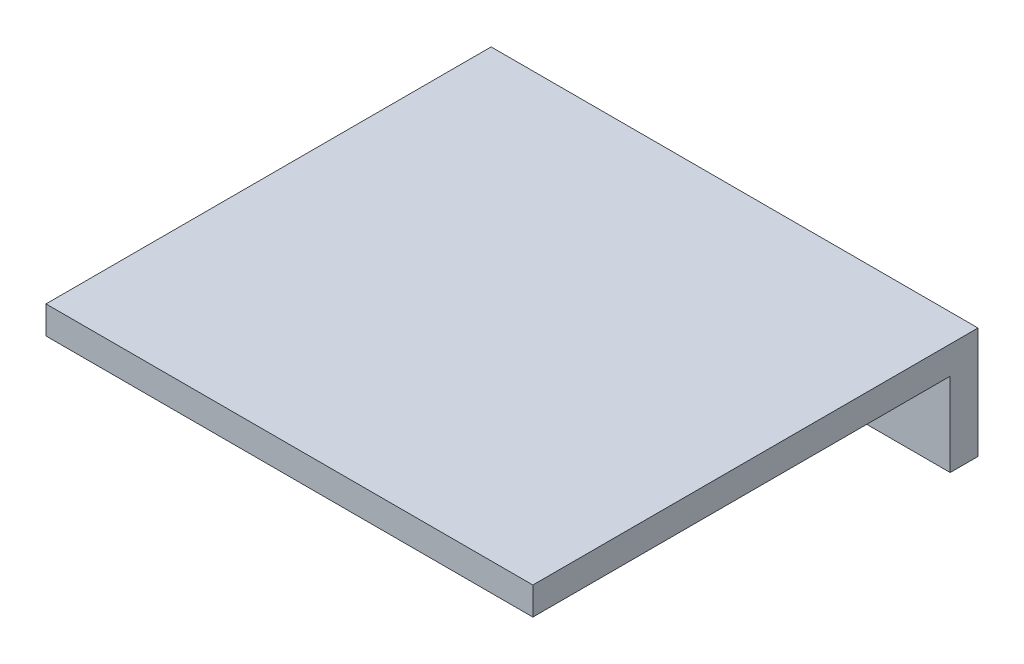
ISO-10303-21;
HEADER;
FILE_DESCRIPTION(('STEP AP214'),'2;1');
FILE_NAME('part.step','',(''),(''),'','','');
FILE_SCHEMA(('AUTOMOTIVE_DESIGN { 1 0 10303 214 1 1 1 1 }'));
ENDSEC;
DATA;
#1=APPLICATION_CONTEXT('core data for automotive mechanical design processes');
#2=APPLICATION_PROTOCOL_DEFINITION('international standard','automotive_design',2000,#1);
#3=PRODUCT_CONTEXT('',#1,'mechanical');
#4=PRODUCT('Part','Part','',(#3));
#5=PRODUCT_RELATED_PRODUCT_CATEGORY('part','',(#4));
#6=PRODUCT_DEFINITION_FORMATION('','',#4);
#7=PRODUCT_DEFINITION_CONTEXT('part definition',#1,'design');
#8=PRODUCT_DEFINITION('design','',#6,#7);
#9=PRODUCT_DEFINITION_SHAPE('','',#8);
#10=(LENGTH_UNIT() NAMED_UNIT(*) SI_UNIT(.MILLI.,.METRE.));
#11=(NAMED_UNIT(*) PLANE_ANGLE_UNIT() SI_UNIT($,.RADIAN.));
#12=(NAMED_UNIT(*) SI_UNIT($,.STERADIAN.) SOLID_ANGLE_UNIT());
#13=UNCERTAINTY_MEASURE_WITH_UNIT(LENGTH_MEASURE(1.E-05),#10,'distance_accuracy_value','');
#14=(GEOMETRIC_REPRESENTATION_CONTEXT(3) GLOBAL_UNCERTAINTY_ASSIGNED_CONTEXT((#13)) GLOBAL_UNIT_ASSIGNED_CONTEXT((#10,
#11,#12)) REPRESENTATION_CONTEXT('',''));
#15=CARTESIAN_POINT('',(0.,0.,0.));
#16=DIRECTION('',(0.,0.,1.));
#17=DIRECTION('',(1.,0.,0.));
#18=AXIS2_PLACEMENT_3D('',#15,#16,#17);
#19=CARTESIAN_POINT('',(0.,0.,2.));
#20=DIRECTION('',(0.,0.,1.));
#21=DIRECTION('',(1.,0.,0.));
#22=AXIS2_PLACEMENT_3D('',#19,#20,#21);
#23=PLANE('',#22);
#24=DIRECTION('',(1.,0.,0.));
#25=VECTOR('',#24,1.);
#26=CARTESIAN_POINT('',(-17.5,2.,2.));
#27=LINE('',#26,#25);
#28=CARTESIAN_POINT('',(-17.5,2.,2.));
#29=VERTEX_POINT('',#28);
#30=CARTESIAN_POINT('',(17.5,2.,2.));
#31=VERTEX_POINT('',#30);
#32=EDGE_CURVE('E61',#29,#31,#27,.T.);
#33=ORIENTED_EDGE('',*,*,#32,.F.);
#34=DIRECTION('',(0.,-1.,0.));
#35=VECTOR('',#34,1.);
#36=CARTESIAN_POINT('',(-17.5,4.,2.));
#37=LINE('',#36,#35);
#38=CARTESIAN_POINT('',(-17.5,-4.,2.));
#39=VERTEX_POINT('',#38);
#40=EDGE_CURVE('E176',#29,#39,#37,.T.);
#41=ORIENTED_EDGE('',*,*,#40,.T.);
#42=DIRECTION('',(1.,0.,0.));
#43=VECTOR('',#42,1.);
#44=CARTESIAN_POINT('',(-17.5,-4.,2.));
#45=LINE('',#44,#43);
#46=CARTESIAN_POINT('',(17.5,-4.,2.));
#47=VERTEX_POINT('',#46);
#48=EDGE_CURVE('E67',#39,#47,#45,.T.);
#49=ORIENTED_EDGE('',*,*,#48,.T.);
#50=DIRECTION('',(0.,1.,0.));
#51=VECTOR('',#50,1.);
#52=CARTESIAN_POINT('',(17.5,4.,2.));
#53=LINE('',#52,#51);
#54=EDGE_CURVE('E97',#47,#31,#53,.T.);
#55=ORIENTED_EDGE('',*,*,#54,.T.);
#56=EDGE_LOOP('',(#33,#41,#49,#55));
#57=FACE_BOUND('',#56,.T.);
#58=CARTESIAN_POINT('',(12.,0.,2.));
#59=DIRECTION('',(0.,0.,1.));
#60=DIRECTION('',(1.,0.,0.));
#61=AXIS2_PLACEMENT_3D('',#58,#59,#60);
#62=CIRCLE('',#61,1.35);
#63=CARTESIAN_POINT('',(13.35,0.,2.));
#64=VERTEX_POINT('',#63);
#65=EDGE_CURVE('E111',#64,#64,#62,.T.);
#66=ORIENTED_EDGE('',*,*,#65,.F.);
#67=EDGE_LOOP('',(#66));
#68=FACE_BOUND('',#67,.T.);
#69=CARTESIAN_POINT('',(-12.,0.,2.));
#70=DIRECTION('',(0.,0.,1.));
#71=DIRECTION('',(-1.,0.,0.));
#72=AXIS2_PLACEMENT_3D('',#69,#70,#71);
#73=CIRCLE('',#72,1.35);
#74=CARTESIAN_POINT('',(-13.35,0.,2.));
#75=VERTEX_POINT('',#74);
#76=EDGE_CURVE('E165',#75,#75,#73,.T.);
#77=ORIENTED_EDGE('',*,*,#76,.F.);
#78=EDGE_LOOP('',(#77));
#79=FACE_BOUND('',#78,.T.);
#80=ADVANCED_FACE('F45',(#57,#68,#79),#23,.T.);
#81=CARTESIAN_POINT('',(0.,0.,0.));
#82=DIRECTION('',(0.,0.,1.));
#83=DIRECTION('',(1.,0.,0.));
#84=AXIS2_PLACEMENT_3D('',#81,#82,#83);
#85=PLANE('',#84);
#86=DIRECTION('',(0.,1.,0.));
#87=VECTOR('',#86,1.);
#88=CARTESIAN_POINT('',(17.5,4.,0.));
#89=LINE('',#88,#87);
#90=CARTESIAN_POINT('',(17.5,-4.,0.));
#91=VERTEX_POINT('',#90);
#92=CARTESIAN_POINT('',(17.5,4.,0.));
#93=VERTEX_POINT('',#92);
#94=EDGE_CURVE('E103',#91,#93,#89,.T.);
#95=ORIENTED_EDGE('',*,*,#94,.F.);
#96=DIRECTION('',(1.,0.,0.));
#97=VECTOR('',#96,1.);
#98=CARTESIAN_POINT('',(-17.5,-4.,0.));
#99=LINE('',#98,#97);
#100=CARTESIAN_POINT('',(-17.5,-4.,0.));
#101=VERTEX_POINT('',#100);
#102=EDGE_CURVE('E86',#101,#91,#99,.T.);
#103=ORIENTED_EDGE('',*,*,#102,.F.);
#104=DIRECTION('',(0.,-1.,0.));
#105=VECTOR('',#104,1.);
#106=CARTESIAN_POINT('',(-17.5,4.,0.));
#107=LINE('',#106,#105);
#108=CARTESIAN_POINT('',(-17.5,4.,0.));
#109=VERTEX_POINT('',#108);
#110=EDGE_CURVE('E98',#109,#101,#107,.T.);
#111=ORIENTED_EDGE('',*,*,#110,.F.);
#112=DIRECTION('',(-1.,0.,0.));
#113=VECTOR('',#112,1.);
#114=CARTESIAN_POINT('',(-17.5,4.,0.));
#115=LINE('',#114,#113);
#116=EDGE_CURVE('E109',#93,#109,#115,.T.);
#117=ORIENTED_EDGE('',*,*,#116,.F.);
#118=EDGE_LOOP('',(#95,#103,#111,#117));
#119=FACE_BOUND('',#118,.T.);
#120=CARTESIAN_POINT('',(12.,0.,0.));
#121=DIRECTION('',(0.,0.,1.));
#122=DIRECTION('',(1.,0.,0.));
#123=AXIS2_PLACEMENT_3D('',#120,#121,#122);
#124=CIRCLE('',#123,1.35);
#125=CARTESIAN_POINT('',(13.35,0.,0.));
#126=VERTEX_POINT('',#125);
#127=EDGE_CURVE('E117',#126,#126,#124,.T.);
#128=ORIENTED_EDGE('',*,*,#127,.T.);
#129=EDGE_LOOP('',(#128));
#130=FACE_BOUND('',#129,.T.);
#131=CARTESIAN_POINT('',(-12.,0.,0.));
#132=DIRECTION('',(0.,0.,1.));
#133=DIRECTION('',(-1.,0.,0.));
#134=AXIS2_PLACEMENT_3D('',#131,#132,#133);
#135=CIRCLE('',#134,1.35);
#136=CARTESIAN_POINT('',(-13.35,0.,0.));
#137=VERTEX_POINT('',#136);
#138=EDGE_CURVE('E164',#137,#137,#135,.T.);
#139=ORIENTED_EDGE('',*,*,#138,.T.);
#140=EDGE_LOOP('',(#139));
#141=FACE_BOUND('',#140,.T.);
#142=ADVANCED_FACE('F107',(#119,#130,#141),#85,.F.);
#143=CARTESIAN_POINT('',(17.5,4.,2.));
#144=DIRECTION('',(-1.,0.,0.));
#145=DIRECTION('',(0.,0.,1.));
#146=AXIS2_PLACEMENT_3D('',#143,#144,#145);
#147=PLANE('',#146);
#148=ORIENTED_EDGE('',*,*,#94,.T.);
#149=DIRECTION('',(0.,0.,-1.));
#150=VECTOR('',#149,1.);
#151=CARTESIAN_POINT('',(17.5,4.,2.));
#152=LINE('',#151,#150);
#153=CARTESIAN_POINT('',(17.5,4.,32.));
#154=VERTEX_POINT('',#153);
#155=EDGE_CURVE('E11',#154,#93,#152,.T.);
#156=ORIENTED_EDGE('',*,*,#155,.F.);
#157=DIRECTION('',(0.,1.,0.));
#158=VECTOR('',#157,1.);
#159=CARTESIAN_POINT('',(17.5,4.,32.));
#160=LINE('',#159,#158);
#161=CARTESIAN_POINT('',(17.5,2.,32.));
#162=VERTEX_POINT('',#161);
#163=EDGE_CURVE('E147',#162,#154,#160,.T.);
#164=ORIENTED_EDGE('',*,*,#163,.F.);
#165=DIRECTION('',(0.,0.,-1.));
#166=VECTOR('',#165,1.);
#167=CARTESIAN_POINT('',(17.5,2.,32.));
#168=LINE('',#167,#166);
#169=EDGE_CURVE('E149',#162,#31,#168,.T.);
#170=ORIENTED_EDGE('',*,*,#169,.T.);
#171=ORIENTED_EDGE('',*,*,#54,.F.);
#172=DIRECTION('',(0.,0.,-1.));
#173=VECTOR('',#172,1.);
#174=CARTESIAN_POINT('',(17.5,-4.,2.));
#175=LINE('',#174,#173);
#176=EDGE_CURVE('E89',#47,#91,#175,.T.);
#177=ORIENTED_EDGE('',*,*,#176,.T.);
#178=EDGE_LOOP('',(#148,#156,#164,#170,#171,#177));
#179=FACE_BOUND('',#178,.T.);
#180=ADVANCED_FACE('F47',(#179),#147,.F.);
#181=CARTESIAN_POINT('',(-17.5,4.,2.));
#182=DIRECTION('',(0.,-1.,0.));
#183=DIRECTION('',(0.,0.,-1.));
#184=AXIS2_PLACEMENT_3D('',#181,#182,#183);
#185=PLANE('',#184);
#186=ORIENTED_EDGE('',*,*,#116,.T.);
#187=DIRECTION('',(0.,0.,-1.));
#188=VECTOR('',#187,1.);
#189=CARTESIAN_POINT('',(-17.5,4.,2.));
#190=LINE('',#189,#188);
#191=CARTESIAN_POINT('',(-17.5,4.,32.));
#192=VERTEX_POINT('',#191);
#193=EDGE_CURVE('E54',#192,#109,#190,.T.);
#194=ORIENTED_EDGE('',*,*,#193,.F.);
#195=DIRECTION('',(-1.,0.,0.));
#196=VECTOR('',#195,1.);
#197=CARTESIAN_POINT('',(-17.5,4.,32.));
#198=LINE('',#197,#196);
#199=EDGE_CURVE('E139',#154,#192,#198,.T.);
#200=ORIENTED_EDGE('',*,*,#199,.F.);
#201=ORIENTED_EDGE('',*,*,#155,.T.);
#202=EDGE_LOOP('',(#186,#194,#200,#201));
#203=FACE_BOUND('',#202,.T.);
#204=ADVANCED_FACE('F137',(#203),#185,.F.);
#205=CARTESIAN_POINT('',(-17.5,4.,2.));
#206=DIRECTION('',(1.,0.,0.));
#207=DIRECTION('',(0.,0.,-1.));
#208=AXIS2_PLACEMENT_3D('',#205,#206,#207);
#209=PLANE('',#208);
#210=ORIENTED_EDGE('',*,*,#110,.T.);
#211=DIRECTION('',(0.,0.,-1.));
#212=VECTOR('',#211,1.);
#213=CARTESIAN_POINT('',(-17.5,-4.,2.));
#214=LINE('',#213,#212);
#215=EDGE_CURVE('E92',#39,#101,#214,.T.);
#216=ORIENTED_EDGE('',*,*,#215,.F.);
#217=ORIENTED_EDGE('',*,*,#40,.F.);
#218=DIRECTION('',(0.,0.,-1.));
#219=VECTOR('',#218,1.);
#220=CARTESIAN_POINT('',(-17.5,2.,32.));
#221=LINE('',#220,#219);
#222=CARTESIAN_POINT('',(-17.5,2.,32.));
#223=VERTEX_POINT('',#222);
#224=EDGE_CURVE('E153',#223,#29,#221,.T.);
#225=ORIENTED_EDGE('',*,*,#224,.F.);
#226=DIRECTION('',(0.,-1.,0.));
#227=VECTOR('',#226,1.);
#228=CARTESIAN_POINT('',(-17.5,4.,32.));
#229=LINE('',#228,#227);
#230=EDGE_CURVE('E133',#192,#223,#229,.T.);
#231=ORIENTED_EDGE('',*,*,#230,.F.);
#232=ORIENTED_EDGE('',*,*,#193,.T.);
#233=EDGE_LOOP('',(#210,#216,#217,#225,#231,#232));
#234=FACE_BOUND('',#233,.T.);
#235=ADVANCED_FACE('F130',(#234),#209,.F.);
#236=CARTESIAN_POINT('',(-17.5,-4.,2.));
#237=DIRECTION('',(0.,1.,0.));
#238=DIRECTION('',(0.,0.,1.));
#239=AXIS2_PLACEMENT_3D('',#236,#237,#238);
#240=PLANE('',#239);
#241=ORIENTED_EDGE('',*,*,#102,.T.);
#242=ORIENTED_EDGE('',*,*,#176,.F.);
#243=ORIENTED_EDGE('',*,*,#48,.F.);
#244=ORIENTED_EDGE('',*,*,#215,.T.);
#245=EDGE_LOOP('',(#241,#242,#243,#244));
#246=FACE_BOUND('',#245,.T.);
#247=ADVANCED_FACE('F88',(#246),#240,.F.);
#248=CARTESIAN_POINT('',(12.,0.,2.));
#249=DIRECTION('',(0.,0.,-1.));
#250=DIRECTION('',(-1.,0.,0.));
#251=AXIS2_PLACEMENT_3D('',#248,#249,#250);
#252=CYLINDRICAL_SURFACE('',#251,1.35);
#253=ORIENTED_EDGE('',*,*,#65,.T.);
#254=EDGE_LOOP('',(#253));
#255=FACE_BOUND('',#254,.T.);
#256=ORIENTED_EDGE('',*,*,#127,.F.);
#257=EDGE_LOOP('',(#256));
#258=FACE_BOUND('',#257,.T.);
#259=ADVANCED_FACE('F201',(#255,#258),#252,.F.);
#260=CARTESIAN_POINT('',(-12.,0.,2.));
#261=DIRECTION('',(0.,0.,-1.));
#262=DIRECTION('',(-1.,0.,0.));
#263=AXIS2_PLACEMENT_3D('',#260,#261,#262);
#264=CYLINDRICAL_SURFACE('',#263,1.35);
#265=ORIENTED_EDGE('',*,*,#76,.T.);
#266=EDGE_LOOP('',(#265));
#267=FACE_BOUND('',#266,.T.);
#268=ORIENTED_EDGE('',*,*,#138,.F.);
#269=EDGE_LOOP('',(#268));
#270=FACE_BOUND('',#269,.T.);
#271=ADVANCED_FACE('F193',(#267,#270),#264,.F.);
#272=CARTESIAN_POINT('',(-17.5,2.,32.));
#273=DIRECTION('',(0.,1.,0.));
#274=DIRECTION('',(0.,0.,1.));
#275=AXIS2_PLACEMENT_3D('',#272,#273,#274);
#276=PLANE('',#275);
#277=ORIENTED_EDGE('',*,*,#32,.T.);
#278=ORIENTED_EDGE('',*,*,#169,.F.);
#279=DIRECTION('',(1.,0.,0.));
#280=VECTOR('',#279,1.);
#281=CARTESIAN_POINT('',(-17.5,2.,32.));
#282=LINE('',#281,#280);
#283=EDGE_CURVE('E155',#223,#162,#282,.T.);
#284=ORIENTED_EDGE('',*,*,#283,.F.);
#285=ORIENTED_EDGE('',*,*,#224,.T.);
#286=EDGE_LOOP('',(#277,#278,#284,#285));
#287=FACE_BOUND('',#286,.T.);
#288=ADVANCED_FACE('F182',(#287),#276,.F.);
#289=CARTESIAN_POINT('',(0.,0.,32.));
#290=DIRECTION('',(0.,0.,1.));
#291=DIRECTION('',(1.,0.,0.));
#292=AXIS2_PLACEMENT_3D('',#289,#290,#291);
#293=PLANE('',#292);
#294=ORIENTED_EDGE('',*,*,#230,.T.);
#295=ORIENTED_EDGE('',*,*,#283,.T.);
#296=ORIENTED_EDGE('',*,*,#163,.T.);
#297=ORIENTED_EDGE('',*,*,#199,.T.);
#298=EDGE_LOOP('',(#294,#295,#296,#297));
#299=FACE_BOUND('',#298,.T.);
#300=ADVANCED_FACE('F143',(#299),#293,.T.);
#301=CLOSED_SHELL('',(#80,#142,#180,#204,#235,#247,#259,#271,#288,#300));
#302=MANIFOLD_SOLID_BREP('B2',#301);
#303=ADVANCED_BREP_SHAPE_REPRESENTATION('',(#18,#302),#14);
#304=SHAPE_DEFINITION_REPRESENTATION(#9,#303);
ENDSEC;
END-ISO-10303-21;
